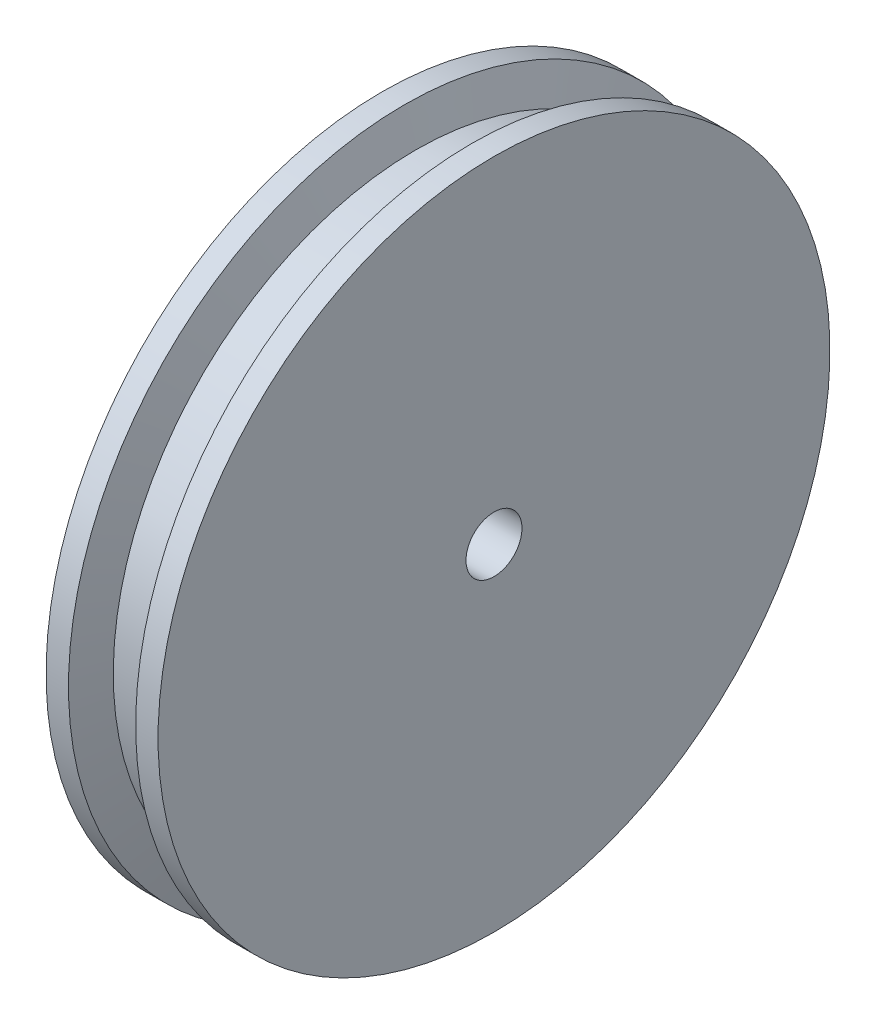
ISO-10303-21;
HEADER;
FILE_DESCRIPTION(('STEP AP214'),'2;1');
FILE_NAME('part.step','',(''),(''),'','','');
FILE_SCHEMA(('AUTOMOTIVE_DESIGN { 1 0 10303 214 1 1 1 1 }'));
ENDSEC;
DATA;
#1=APPLICATION_CONTEXT('core data for automotive mechanical design processes');
#2=APPLICATION_PROTOCOL_DEFINITION('international standard','automotive_design',2000,#1);
#3=PRODUCT_CONTEXT('',#1,'mechanical');
#4=PRODUCT('Part','Part','',(#3));
#5=PRODUCT_RELATED_PRODUCT_CATEGORY('part','',(#4));
#6=PRODUCT_DEFINITION_FORMATION('','',#4);
#7=PRODUCT_DEFINITION_CONTEXT('part definition',#1,'design');
#8=PRODUCT_DEFINITION('design','',#6,#7);
#9=PRODUCT_DEFINITION_SHAPE('','',#8);
#10=(LENGTH_UNIT() NAMED_UNIT(*) SI_UNIT(.MILLI.,.METRE.));
#11=(NAMED_UNIT(*) PLANE_ANGLE_UNIT() SI_UNIT($,.RADIAN.));
#12=(NAMED_UNIT(*) SI_UNIT($,.STERADIAN.) SOLID_ANGLE_UNIT());
#13=UNCERTAINTY_MEASURE_WITH_UNIT(LENGTH_MEASURE(1.E-05),#10,'distance_accuracy_value','');
#14=(GEOMETRIC_REPRESENTATION_CONTEXT(3) GLOBAL_UNCERTAINTY_ASSIGNED_CONTEXT((#13)) GLOBAL_UNIT_ASSIGNED_CONTEXT((#10,
#11,#12)) REPRESENTATION_CONTEXT('',''));
#15=CARTESIAN_POINT('',(0.,0.,0.));
#16=DIRECTION('',(0.,0.,1.));
#17=DIRECTION('',(1.,0.,0.));
#18=AXIS2_PLACEMENT_3D('',#15,#16,#17);
#19=CARTESIAN_POINT('',(0.,0.,0.));
#20=DIRECTION('',(-1.,0.,0.));
#21=DIRECTION('',(0.,-1.,0.));
#22=AXIS2_PLACEMENT_3D('',#19,#20,#21);
#23=PLANE('',#22);
#24=CARTESIAN_POINT('',(0.,0.,0.));
#25=DIRECTION('',(1.,0.,0.));
#26=DIRECTION('',(0.,1.,0.));
#27=AXIS2_PLACEMENT_3D('',#24,#25,#26);
#28=CIRCLE('',#27,2.5);
#29=CARTESIAN_POINT('',(0.,2.5,0.));
#30=VERTEX_POINT('',#29);
#31=EDGE_CURVE('E68',#30,#30,#28,.T.);
#32=ORIENTED_EDGE('',*,*,#31,.T.);
#33=EDGE_LOOP('',(#32));
#34=FACE_BOUND('',#33,.T.);
#35=CARTESIAN_POINT('',(0.,0.,0.));
#36=DIRECTION('',(1.,0.,0.));
#37=DIRECTION('',(0.,1.,0.));
#38=AXIS2_PLACEMENT_3D('',#35,#36,#37);
#39=CIRCLE('',#38,30.);
#40=CARTESIAN_POINT('',(0.,30.,0.));
#41=VERTEX_POINT('',#40);
#42=EDGE_CURVE('E10',#41,#41,#39,.T.);
#43=ORIENTED_EDGE('',*,*,#42,.F.);
#44=EDGE_LOOP('',(#43));
#45=FACE_BOUND('',#44,.T.);
#46=ADVANCED_FACE('F37',(#34,#45),#23,.T.);
#47=CARTESIAN_POINT('',(10.,0.,0.));
#48=DIRECTION('',(1.,0.,0.));
#49=DIRECTION('',(0.,1.,0.));
#50=AXIS2_PLACEMENT_3D('',#47,#48,#49);
#51=CYLINDRICAL_SURFACE('',#50,30.);
#52=ORIENTED_EDGE('',*,*,#42,.T.);
#53=EDGE_LOOP('',(#52));
#54=FACE_BOUND('',#53,.T.);
#55=CARTESIAN_POINT('',(2.,0.,0.));
#56=DIRECTION('',(1.,0.,0.));
#57=DIRECTION('',(0.,1.,0.));
#58=AXIS2_PLACEMENT_3D('',#55,#56,#57);
#59=CIRCLE('',#58,30.);
#60=CARTESIAN_POINT('',(2.,30.,0.));
#61=VERTEX_POINT('',#60);
#62=EDGE_CURVE('E44',#61,#61,#59,.T.);
#63=ORIENTED_EDGE('',*,*,#62,.F.);
#64=EDGE_LOOP('',(#63));
#65=FACE_BOUND('',#64,.T.);
#66=ADVANCED_FACE('F103',(#54,#65),#51,.T.);
#67=CARTESIAN_POINT('',(3.,0.,0.));
#68=DIRECTION('',(-1.,0.,0.));
#69=DIRECTION('',(0.,-1.,0.));
#70=AXIS2_PLACEMENT_3D('',#67,#68,#69);
#71=CONICAL_SURFACE('',#70,27.,1.24904577239825);
#72=ORIENTED_EDGE('',*,*,#62,.T.);
#73=EDGE_LOOP('',(#72));
#74=FACE_BOUND('',#73,.T.);
#75=CARTESIAN_POINT('',(3.,0.,0.));
#76=DIRECTION('',(1.,0.,0.));
#77=DIRECTION('',(0.,1.,0.));
#78=AXIS2_PLACEMENT_3D('',#75,#76,#77);
#79=CIRCLE('',#78,27.);
#80=CARTESIAN_POINT('',(3.,27.,0.));
#81=VERTEX_POINT('',#80);
#82=EDGE_CURVE('E49',#81,#81,#79,.T.);
#83=ORIENTED_EDGE('',*,*,#82,.F.);
#84=EDGE_LOOP('',(#83));
#85=FACE_BOUND('',#84,.T.);
#86=ADVANCED_FACE('F107',(#74,#85),#71,.T.);
#87=CARTESIAN_POINT('',(10.,0.,0.));
#88=DIRECTION('',(1.,0.,0.));
#89=DIRECTION('',(0.,1.,0.));
#90=AXIS2_PLACEMENT_3D('',#87,#88,#89);
#91=CYLINDRICAL_SURFACE('',#90,27.);
#92=ORIENTED_EDGE('',*,*,#82,.T.);
#93=EDGE_LOOP('',(#92));
#94=FACE_BOUND('',#93,.T.);
#95=CARTESIAN_POINT('',(7.,0.,0.));
#96=DIRECTION('',(1.,0.,0.));
#97=DIRECTION('',(0.,1.,0.));
#98=AXIS2_PLACEMENT_3D('',#95,#96,#97);
#99=CIRCLE('',#98,27.);
#100=CARTESIAN_POINT('',(7.,27.,0.));
#101=VERTEX_POINT('',#100);
#102=EDGE_CURVE('E54',#101,#101,#99,.T.);
#103=ORIENTED_EDGE('',*,*,#102,.F.);
#104=EDGE_LOOP('',(#103));
#105=FACE_BOUND('',#104,.T.);
#106=ADVANCED_FACE('F99',(#94,#105),#91,.T.);
#107=CARTESIAN_POINT('',(8.,0.,0.));
#108=DIRECTION('',(1.,0.,0.));
#109=DIRECTION('',(0.,1.,0.));
#110=AXIS2_PLACEMENT_3D('',#107,#108,#109);
#111=CONICAL_SURFACE('',#110,30.,1.24904577239826);
#112=ORIENTED_EDGE('',*,*,#102,.T.);
#113=EDGE_LOOP('',(#112));
#114=FACE_BOUND('',#113,.T.);
#115=CARTESIAN_POINT('',(8.,0.,0.));
#116=DIRECTION('',(1.,0.,0.));
#117=DIRECTION('',(0.,1.,0.));
#118=AXIS2_PLACEMENT_3D('',#115,#116,#117);
#119=CIRCLE('',#118,30.);
#120=CARTESIAN_POINT('',(8.,30.,0.));
#121=VERTEX_POINT('',#120);
#122=EDGE_CURVE('E60',#121,#121,#119,.T.);
#123=ORIENTED_EDGE('',*,*,#122,.F.);
#124=EDGE_LOOP('',(#123));
#125=FACE_BOUND('',#124,.T.);
#126=ADVANCED_FACE('F93',(#114,#125),#111,.T.);
#127=CARTESIAN_POINT('',(10.,0.,0.));
#128=DIRECTION('',(1.,0.,0.));
#129=DIRECTION('',(0.,1.,0.));
#130=AXIS2_PLACEMENT_3D('',#127,#128,#129);
#131=CYLINDRICAL_SURFACE('',#130,30.);
#132=ORIENTED_EDGE('',*,*,#122,.T.);
#133=EDGE_LOOP('',(#132));
#134=FACE_BOUND('',#133,.T.);
#135=CARTESIAN_POINT('',(10.,0.,0.));
#136=DIRECTION('',(1.,0.,0.));
#137=DIRECTION('',(0.,1.,0.));
#138=AXIS2_PLACEMENT_3D('',#135,#136,#137);
#139=CIRCLE('',#138,30.);
#140=CARTESIAN_POINT('',(10.,30.,0.));
#141=VERTEX_POINT('',#140);
#142=EDGE_CURVE('E64',#141,#141,#139,.T.);
#143=ORIENTED_EDGE('',*,*,#142,.F.);
#144=EDGE_LOOP('',(#143));
#145=FACE_BOUND('',#144,.T.);
#146=ADVANCED_FACE('F88',(#134,#145),#131,.T.);
#147=CARTESIAN_POINT('',(10.,30.,0.));
#148=DIRECTION('',(1.,0.,0.));
#149=DIRECTION('',(0.,1.,0.));
#150=AXIS2_PLACEMENT_3D('',#147,#148,#149);
#151=PLANE('',#150);
#152=CARTESIAN_POINT('',(10.,0.,0.));
#153=DIRECTION('',(1.,0.,0.));
#154=DIRECTION('',(0.,1.,0.));
#155=AXIS2_PLACEMENT_3D('',#152,#153,#154);
#156=CIRCLE('',#155,2.5);
#157=CARTESIAN_POINT('',(10.,2.5,0.));
#158=VERTEX_POINT('',#157);
#159=EDGE_CURVE('E69',#158,#158,#156,.T.);
#160=ORIENTED_EDGE('',*,*,#159,.F.);
#161=EDGE_LOOP('',(#160));
#162=FACE_BOUND('',#161,.T.);
#163=ORIENTED_EDGE('',*,*,#142,.T.);
#164=EDGE_LOOP('',(#163));
#165=FACE_BOUND('',#164,.T.);
#166=ADVANCED_FACE('F82',(#162,#165),#151,.T.);
#167=CARTESIAN_POINT('',(0.,0.,0.));
#168=DIRECTION('',(1.,0.,0.));
#169=DIRECTION('',(0.,1.,0.));
#170=AXIS2_PLACEMENT_3D('',#167,#168,#169);
#171=CYLINDRICAL_SURFACE('',#170,2.5);
#172=ORIENTED_EDGE('',*,*,#31,.F.);
#173=EDGE_LOOP('',(#172));
#174=FACE_BOUND('',#173,.T.);
#175=ORIENTED_EDGE('',*,*,#159,.T.);
#176=EDGE_LOOP('',(#175));
#177=FACE_BOUND('',#176,.T.);
#178=ADVANCED_FACE('F79',(#174,#177),#171,.F.);
#179=CLOSED_SHELL('',(#46,#66,#86,#106,#126,#146,#166,#178));
#180=MANIFOLD_SOLID_BREP('B2',#179);
#181=ADVANCED_BREP_SHAPE_REPRESENTATION('',(#18,#180),#14);
#182=SHAPE_DEFINITION_REPRESENTATION(#9,#181);
ENDSEC;
END-ISO-10303-21;
